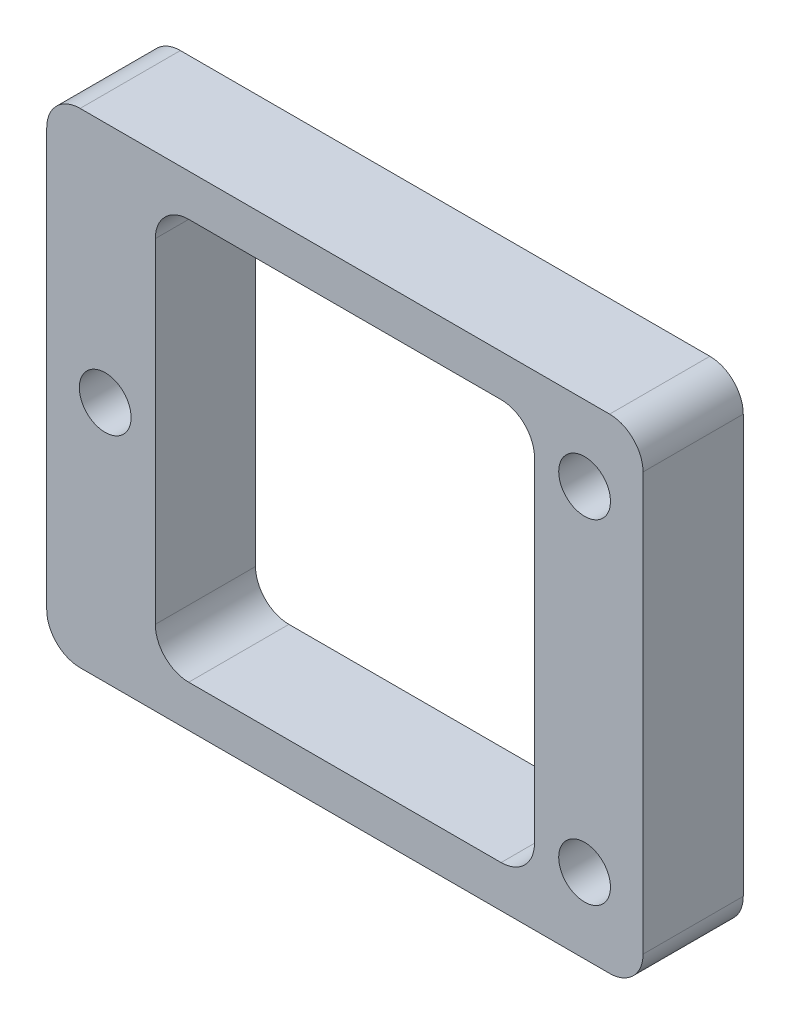
ISO-10303-21;
HEADER;
FILE_DESCRIPTION(('STEP AP214'),'2;1');
FILE_NAME('part.step','',(''),(''),'','','');
FILE_SCHEMA(('AUTOMOTIVE_DESIGN { 1 0 10303 214 1 1 1 1 }'));
ENDSEC;
DATA;
#1=APPLICATION_CONTEXT('core data for automotive mechanical design processes');
#2=APPLICATION_PROTOCOL_DEFINITION('international standard','automotive_design',2000,#1);
#3=PRODUCT_CONTEXT('',#1,'mechanical');
#4=PRODUCT('Part','Part','',(#3));
#5=PRODUCT_RELATED_PRODUCT_CATEGORY('part','',(#4));
#6=PRODUCT_DEFINITION_FORMATION('','',#4);
#7=PRODUCT_DEFINITION_CONTEXT('part definition',#1,'design');
#8=PRODUCT_DEFINITION('design','',#6,#7);
#9=PRODUCT_DEFINITION_SHAPE('','',#8);
#10=(LENGTH_UNIT() NAMED_UNIT(*) SI_UNIT(.MILLI.,.METRE.));
#11=(NAMED_UNIT(*) PLANE_ANGLE_UNIT() SI_UNIT($,.RADIAN.));
#12=(NAMED_UNIT(*) SI_UNIT($,.STERADIAN.) SOLID_ANGLE_UNIT());
#13=UNCERTAINTY_MEASURE_WITH_UNIT(LENGTH_MEASURE(1.E-05),#10,'distance_accuracy_value','');
#14=(GEOMETRIC_REPRESENTATION_CONTEXT(3) GLOBAL_UNCERTAINTY_ASSIGNED_CONTEXT((#13)) GLOBAL_UNIT_ASSIGNED_CONTEXT((#10,
#11,#12)) REPRESENTATION_CONTEXT('',''));
#15=CARTESIAN_POINT('',(0.,0.,0.));
#16=DIRECTION('',(0.,0.,1.));
#17=DIRECTION('',(1.,0.,0.));
#18=AXIS2_PLACEMENT_3D('',#15,#16,#17);
#19=CARTESIAN_POINT('',(17.85,-14.5,6.));
#20=DIRECTION('',(-1.,0.,0.));
#21=DIRECTION('',(0.,0.,1.));
#22=AXIS2_PLACEMENT_3D('',#19,#20,#21);
#23=PLANE('',#22);
#24=DIRECTION('',(0.,1.,0.));
#25=VECTOR('',#24,1.);
#26=CARTESIAN_POINT('',(17.85,-14.5,6.));
#27=LINE('',#26,#25);
#28=CARTESIAN_POINT('',(17.85,-12.5,6.));
#29=VERTEX_POINT('',#28);
#30=CARTESIAN_POINT('',(17.85,12.5,6.));
#31=VERTEX_POINT('',#30);
#32=EDGE_CURVE('E172',#29,#31,#27,.T.);
#33=ORIENTED_EDGE('',*,*,#32,.F.);
#34=DIRECTION('',(0.,0.,-1.));
#35=VECTOR('',#34,1.);
#36=CARTESIAN_POINT('',(17.85,-12.5,6.));
#37=LINE('',#36,#35);
#38=CARTESIAN_POINT('',(17.85,-12.5,0.));
#39=VERTEX_POINT('',#38);
#40=EDGE_CURVE('E157',#29,#39,#37,.T.);
#41=ORIENTED_EDGE('',*,*,#40,.T.);
#42=DIRECTION('',(0.,1.,0.));
#43=VECTOR('',#42,1.);
#44=CARTESIAN_POINT('',(17.85,-14.5,0.));
#45=LINE('',#44,#43);
#46=CARTESIAN_POINT('',(17.85,12.5,0.));
#47=VERTEX_POINT('',#46);
#48=EDGE_CURVE('E169',#39,#47,#45,.T.);
#49=ORIENTED_EDGE('',*,*,#48,.T.);
#50=DIRECTION('',(0.,0.,-1.));
#51=VECTOR('',#50,1.);
#52=CARTESIAN_POINT('',(17.85,12.5,6.));
#53=LINE('',#52,#51);
#54=EDGE_CURVE('E174',#47,#31,#53,.F.);
#55=ORIENTED_EDGE('',*,*,#54,.T.);
#56=EDGE_LOOP('',(#33,#41,#49,#55));
#57=FACE_BOUND('',#56,.T.);
#58=ADVANCED_FACE('F39',(#57),#23,.F.);
#59=CARTESIAN_POINT('',(-17.85,14.5,6.));
#60=DIRECTION('',(0.,-1.,0.));
#61=DIRECTION('',(0.,0.,-1.));
#62=AXIS2_PLACEMENT_3D('',#59,#60,#61);
#63=PLANE('',#62);
#64=DIRECTION('',(-1.,0.,0.));
#65=VECTOR('',#64,1.);
#66=CARTESIAN_POINT('',(-17.85,14.5,0.));
#67=LINE('',#66,#65);
#68=CARTESIAN_POINT('',(15.85,14.5,0.));
#69=VERTEX_POINT('',#68);
#70=CARTESIAN_POINT('',(-15.85,14.5,0.));
#71=VERTEX_POINT('',#70);
#72=EDGE_CURVE('E178',#69,#71,#67,.T.);
#73=ORIENTED_EDGE('',*,*,#72,.T.);
#74=DIRECTION('',(0.,0.,-1.));
#75=VECTOR('',#74,1.);
#76=CARTESIAN_POINT('',(-15.85,14.5,6.));
#77=LINE('',#76,#75);
#78=CARTESIAN_POINT('',(-15.85,14.5,6.));
#79=VERTEX_POINT('',#78);
#80=EDGE_CURVE('E243',#71,#79,#77,.F.);
#81=ORIENTED_EDGE('',*,*,#80,.T.);
#82=DIRECTION('',(-1.,0.,0.));
#83=VECTOR('',#82,1.);
#84=CARTESIAN_POINT('',(-17.85,14.5,6.));
#85=LINE('',#84,#83);
#86=CARTESIAN_POINT('',(15.85,14.5,6.));
#87=VERTEX_POINT('',#86);
#88=EDGE_CURVE('E314',#87,#79,#85,.T.);
#89=ORIENTED_EDGE('',*,*,#88,.F.);
#90=DIRECTION('',(0.,0.,-1.));
#91=VECTOR('',#90,1.);
#92=CARTESIAN_POINT('',(15.85,14.5,6.));
#93=LINE('',#92,#91);
#94=EDGE_CURVE('E240',#87,#69,#93,.T.);
#95=ORIENTED_EDGE('',*,*,#94,.T.);
#96=EDGE_LOOP('',(#73,#81,#89,#95));
#97=FACE_BOUND('',#96,.T.);
#98=ADVANCED_FACE('F346',(#97),#63,.F.);
#99=CARTESIAN_POINT('',(-17.85,-14.5,6.));
#100=DIRECTION('',(1.,0.,0.));
#101=DIRECTION('',(0.,0.,-1.));
#102=AXIS2_PLACEMENT_3D('',#99,#100,#101);
#103=PLANE('',#102);
#104=DIRECTION('',(0.,-1.,0.));
#105=VECTOR('',#104,1.);
#106=CARTESIAN_POINT('',(-17.85,-14.5,0.));
#107=LINE('',#106,#105);
#108=CARTESIAN_POINT('',(-17.85,12.5,0.));
#109=VERTEX_POINT('',#108);
#110=CARTESIAN_POINT('',(-17.85,-12.5,0.));
#111=VERTEX_POINT('',#110);
#112=EDGE_CURVE('E182',#109,#111,#107,.T.);
#113=ORIENTED_EDGE('',*,*,#112,.T.);
#114=DIRECTION('',(0.,0.,-1.));
#115=VECTOR('',#114,1.);
#116=CARTESIAN_POINT('',(-17.85,-12.5,6.));
#117=LINE('',#116,#115);
#118=CARTESIAN_POINT('',(-17.85,-12.5,6.));
#119=VERTEX_POINT('',#118);
#120=EDGE_CURVE('E54',#111,#119,#117,.F.);
#121=ORIENTED_EDGE('',*,*,#120,.T.);
#122=DIRECTION('',(0.,-1.,0.));
#123=VECTOR('',#122,1.);
#124=CARTESIAN_POINT('',(-17.85,-14.5,6.));
#125=LINE('',#124,#123);
#126=CARTESIAN_POINT('',(-17.85,12.5,6.));
#127=VERTEX_POINT('',#126);
#128=EDGE_CURVE('E316',#127,#119,#125,.T.);
#129=ORIENTED_EDGE('',*,*,#128,.F.);
#130=DIRECTION('',(0.,0.,-1.));
#131=VECTOR('',#130,1.);
#132=CARTESIAN_POINT('',(-17.85,12.5,6.));
#133=LINE('',#132,#131);
#134=EDGE_CURVE('E216',#127,#109,#133,.T.);
#135=ORIENTED_EDGE('',*,*,#134,.T.);
#136=EDGE_LOOP('',(#113,#121,#129,#135));
#137=FACE_BOUND('',#136,.T.);
#138=ADVANCED_FACE('F342',(#137),#103,.F.);
#139=CARTESIAN_POINT('',(-17.85,-14.5,6.));
#140=DIRECTION('',(0.,1.,0.));
#141=DIRECTION('',(0.,0.,1.));
#142=AXIS2_PLACEMENT_3D('',#139,#140,#141);
#143=PLANE('',#142);
#144=DIRECTION('',(1.,0.,0.));
#145=VECTOR('',#144,1.);
#146=CARTESIAN_POINT('',(-17.85,-14.5,0.));
#147=LINE('',#146,#145);
#148=CARTESIAN_POINT('',(-15.85,-14.5,0.));
#149=VERTEX_POINT('',#148);
#150=CARTESIAN_POINT('',(15.85,-14.5,0.));
#151=VERTEX_POINT('',#150);
#152=EDGE_CURVE('E315',#149,#151,#147,.T.);
#153=ORIENTED_EDGE('',*,*,#152,.T.);
#154=DIRECTION('',(0.,0.,-1.));
#155=VECTOR('',#154,1.);
#156=CARTESIAN_POINT('',(15.85,-14.5,6.));
#157=LINE('',#156,#155);
#158=CARTESIAN_POINT('',(15.85,-14.5,6.));
#159=VERTEX_POINT('',#158);
#160=EDGE_CURVE('E158',#151,#159,#157,.F.);
#161=ORIENTED_EDGE('',*,*,#160,.T.);
#162=DIRECTION('',(1.,0.,0.));
#163=VECTOR('',#162,1.);
#164=CARTESIAN_POINT('',(-17.85,-14.5,6.));
#165=LINE('',#164,#163);
#166=CARTESIAN_POINT('',(-15.85,-14.5,6.));
#167=VERTEX_POINT('',#166);
#168=EDGE_CURVE('E189',#167,#159,#165,.T.);
#169=ORIENTED_EDGE('',*,*,#168,.F.);
#170=DIRECTION('',(0.,0.,-1.));
#171=VECTOR('',#170,1.);
#172=CARTESIAN_POINT('',(-15.85,-14.5,6.));
#173=LINE('',#172,#171);
#174=EDGE_CURVE('E163',#167,#149,#173,.T.);
#175=ORIENTED_EDGE('',*,*,#174,.T.);
#176=EDGE_LOOP('',(#153,#161,#169,#175));
#177=FACE_BOUND('',#176,.T.);
#178=ADVANCED_FACE('F330',(#177),#143,.F.);
#179=CARTESIAN_POINT('',(0.,0.,6.));
#180=DIRECTION('',(0.,0.,-1.));
#181=DIRECTION('',(-1.,0.,0.));
#182=AXIS2_PLACEMENT_3D('',#179,#180,#181);
#183=PLANE('',#182);
#184=DIRECTION('',(0.,-1.,0.));
#185=VECTOR('',#184,1.);
#186=CARTESIAN_POINT('',(11.35,0.,6.));
#187=LINE('',#186,#185);
#188=CARTESIAN_POINT('',(11.35,9.99999999999999,6.));
#189=VERTEX_POINT('',#188);
#190=CARTESIAN_POINT('',(11.35,-10.,6.));
#191=VERTEX_POINT('',#190);
#192=EDGE_CURVE('E293',#189,#191,#187,.T.);
#193=ORIENTED_EDGE('',*,*,#192,.T.);
#194=CARTESIAN_POINT('',(9.35,-10.,6.));
#195=DIRECTION('',(0.,0.,-1.));
#196=DIRECTION('',(-1.,0.,0.));
#197=AXIS2_PLACEMENT_3D('',#194,#195,#196);
#198=CIRCLE('',#197,2.);
#199=CARTESIAN_POINT('',(9.35,-12.,6.));
#200=VERTEX_POINT('',#199);
#201=EDGE_CURVE('E247',#191,#200,#198,.T.);
#202=ORIENTED_EDGE('',*,*,#201,.T.);
#203=DIRECTION('',(-1.,0.,0.));
#204=VECTOR('',#203,1.);
#205=CARTESIAN_POINT('',(0.,-12.,6.));
#206=LINE('',#205,#204);
#207=CARTESIAN_POINT('',(-9.35,-12.,6.));
#208=VERTEX_POINT('',#207);
#209=EDGE_CURVE('E285',#200,#208,#206,.T.);
#210=ORIENTED_EDGE('',*,*,#209,.T.);
#211=CARTESIAN_POINT('',(-9.35,-10.,6.));
#212=DIRECTION('',(0.,0.,-1.));
#213=DIRECTION('',(-1.,0.,0.));
#214=AXIS2_PLACEMENT_3D('',#211,#212,#213);
#215=CIRCLE('',#214,2.);
#216=CARTESIAN_POINT('',(-11.35,-10.,6.));
#217=VERTEX_POINT('',#216);
#218=EDGE_CURVE('E12',#208,#217,#215,.T.);
#219=ORIENTED_EDGE('',*,*,#218,.T.);
#220=DIRECTION('',(0.,1.,0.));
#221=VECTOR('',#220,1.);
#222=CARTESIAN_POINT('',(-11.35,0.,6.));
#223=LINE('',#222,#221);
#224=CARTESIAN_POINT('',(-11.35,10.,6.));
#225=VERTEX_POINT('',#224);
#226=EDGE_CURVE('E283',#217,#225,#223,.T.);
#227=ORIENTED_EDGE('',*,*,#226,.T.);
#228=CARTESIAN_POINT('',(-9.35,10.,6.));
#229=DIRECTION('',(0.,0.,-1.));
#230=DIRECTION('',(-1.,0.,0.));
#231=AXIS2_PLACEMENT_3D('',#228,#229,#230);
#232=CIRCLE('',#231,2.);
#233=CARTESIAN_POINT('',(-9.35,12.,6.));
#234=VERTEX_POINT('',#233);
#235=EDGE_CURVE('E255',#225,#234,#232,.T.);
#236=ORIENTED_EDGE('',*,*,#235,.T.);
#237=DIRECTION('',(1.,0.,0.));
#238=VECTOR('',#237,1.);
#239=CARTESIAN_POINT('',(0.,12.,6.));
#240=LINE('',#239,#238);
#241=CARTESIAN_POINT('',(9.35,12.,6.));
#242=VERTEX_POINT('',#241);
#243=EDGE_CURVE('E272',#234,#242,#240,.T.);
#244=ORIENTED_EDGE('',*,*,#243,.T.);
#245=CARTESIAN_POINT('',(9.35,9.99999999999999,6.));
#246=DIRECTION('',(0.,0.,-1.));
#247=DIRECTION('',(-1.,0.,0.));
#248=AXIS2_PLACEMENT_3D('',#245,#246,#247);
#249=CIRCLE('',#248,2.);
#250=EDGE_CURVE('E251',#242,#189,#249,.T.);
#251=ORIENTED_EDGE('',*,*,#250,.T.);
#252=EDGE_LOOP('',(#193,#202,#210,#219,#227,#236,#244,#251));
#253=FACE_BOUND('',#252,.T.);
#254=CARTESIAN_POINT('',(-14.35,0.,6.));
#255=DIRECTION('',(0.,0.,-1.));
#256=DIRECTION('',(-1.,0.,0.));
#257=AXIS2_PLACEMENT_3D('',#254,#255,#256);
#258=CIRCLE('',#257,1.55);
#259=CARTESIAN_POINT('',(-15.9,0.,6.));
#260=VERTEX_POINT('',#259);
#261=EDGE_CURVE('E179',#260,#260,#258,.T.);
#262=ORIENTED_EDGE('',*,*,#261,.T.);
#263=EDGE_LOOP('',(#262));
#264=FACE_BOUND('',#263,.T.);
#265=CARTESIAN_POINT('',(14.35,10.,6.));
#266=DIRECTION('',(0.,0.,-1.));
#267=DIRECTION('',(-1.,0.,0.));
#268=AXIS2_PLACEMENT_3D('',#265,#266,#267);
#269=CIRCLE('',#268,1.55);
#270=CARTESIAN_POINT('',(12.8,10.,6.));
#271=VERTEX_POINT('',#270);
#272=EDGE_CURVE('E300',#271,#271,#269,.T.);
#273=ORIENTED_EDGE('',*,*,#272,.T.);
#274=EDGE_LOOP('',(#273));
#275=FACE_BOUND('',#274,.T.);
#276=CARTESIAN_POINT('',(14.35,-10.,6.));
#277=DIRECTION('',(0.,0.,-1.));
#278=DIRECTION('',(-1.,0.,0.));
#279=AXIS2_PLACEMENT_3D('',#276,#277,#278);
#280=CIRCLE('',#279,1.55);
#281=CARTESIAN_POINT('',(12.8,-10.,6.));
#282=VERTEX_POINT('',#281);
#283=EDGE_CURVE('E292',#282,#282,#280,.T.);
#284=ORIENTED_EDGE('',*,*,#283,.T.);
#285=EDGE_LOOP('',(#284));
#286=FACE_BOUND('',#285,.T.);
#287=ORIENTED_EDGE('',*,*,#168,.T.);
#288=CARTESIAN_POINT('',(15.85,-12.5,6.));
#289=DIRECTION('',(0.,0.,-1.));
#290=DIRECTION('',(-1.,0.,0.));
#291=AXIS2_PLACEMENT_3D('',#288,#289,#290);
#292=CIRCLE('',#291,2.);
#293=EDGE_CURVE('E214',#159,#29,#292,.F.);
#294=ORIENTED_EDGE('',*,*,#293,.T.);
#295=ORIENTED_EDGE('',*,*,#32,.T.);
#296=CARTESIAN_POINT('',(15.85,12.5,6.));
#297=DIRECTION('',(0.,0.,-1.));
#298=DIRECTION('',(-1.,0.,0.));
#299=AXIS2_PLACEMENT_3D('',#296,#297,#298);
#300=CIRCLE('',#299,2.);
#301=EDGE_CURVE('E209',#31,#87,#300,.F.);
#302=ORIENTED_EDGE('',*,*,#301,.T.);
#303=ORIENTED_EDGE('',*,*,#88,.T.);
#304=CARTESIAN_POINT('',(-15.85,12.5,6.));
#305=DIRECTION('',(0.,0.,-1.));
#306=DIRECTION('',(-1.,0.,0.));
#307=AXIS2_PLACEMENT_3D('',#304,#305,#306);
#308=CIRCLE('',#307,2.);
#309=EDGE_CURVE('E61',#79,#127,#308,.F.);
#310=ORIENTED_EDGE('',*,*,#309,.T.);
#311=ORIENTED_EDGE('',*,*,#128,.T.);
#312=CARTESIAN_POINT('',(-15.85,-12.5,6.));
#313=DIRECTION('',(0.,0.,-1.));
#314=DIRECTION('',(-1.,0.,0.));
#315=AXIS2_PLACEMENT_3D('',#312,#313,#314);
#316=CIRCLE('',#315,2.);
#317=EDGE_CURVE('E212',#119,#167,#316,.F.);
#318=ORIENTED_EDGE('',*,*,#317,.T.);
#319=EDGE_LOOP('',(#287,#294,#295,#302,#303,#310,#311,#318));
#320=FACE_BOUND('',#319,.T.);
#321=ADVANCED_FACE('F281',(#253,#264,#275,#286,#320),#183,.F.);
#322=CARTESIAN_POINT('',(0.,0.,0.));
#323=DIRECTION('',(0.,0.,-1.));
#324=DIRECTION('',(-1.,0.,0.));
#325=AXIS2_PLACEMENT_3D('',#322,#323,#324);
#326=PLANE('',#325);
#327=DIRECTION('',(0.,1.,0.));
#328=VECTOR('',#327,1.);
#329=CARTESIAN_POINT('',(-11.35,-12.,0.));
#330=LINE('',#329,#328);
#331=CARTESIAN_POINT('',(-11.35,-10.,0.));
#332=VERTEX_POINT('',#331);
#333=CARTESIAN_POINT('',(-11.35,10.,0.));
#334=VERTEX_POINT('',#333);
#335=EDGE_CURVE('E263',#332,#334,#330,.T.);
#336=ORIENTED_EDGE('',*,*,#335,.F.);
#337=CARTESIAN_POINT('',(-9.35,-10.,0.));
#338=DIRECTION('',(0.,0.,-1.));
#339=DIRECTION('',(-1.,0.,0.));
#340=AXIS2_PLACEMENT_3D('',#337,#338,#339);
#341=CIRCLE('',#340,2.);
#342=CARTESIAN_POINT('',(-9.35,-12.,0.));
#343=VERTEX_POINT('',#342);
#344=EDGE_CURVE('E47',#332,#343,#341,.F.);
#345=ORIENTED_EDGE('',*,*,#344,.T.);
#346=DIRECTION('',(-1.,0.,0.));
#347=VECTOR('',#346,1.);
#348=CARTESIAN_POINT('',(11.35,-12.,0.));
#349=LINE('',#348,#347);
#350=CARTESIAN_POINT('',(9.35,-12.,0.));
#351=VERTEX_POINT('',#350);
#352=EDGE_CURVE('E261',#351,#343,#349,.T.);
#353=ORIENTED_EDGE('',*,*,#352,.F.);
#354=CARTESIAN_POINT('',(9.35,-10.,0.));
#355=DIRECTION('',(0.,0.,-1.));
#356=DIRECTION('',(-1.,0.,0.));
#357=AXIS2_PLACEMENT_3D('',#354,#355,#356);
#358=CIRCLE('',#357,2.);
#359=CARTESIAN_POINT('',(11.35,-10.,0.));
#360=VERTEX_POINT('',#359);
#361=EDGE_CURVE('E245',#351,#360,#358,.F.);
#362=ORIENTED_EDGE('',*,*,#361,.T.);
#363=DIRECTION('',(0.,-1.,0.));
#364=VECTOR('',#363,1.);
#365=CARTESIAN_POINT('',(11.35,-12.,0.));
#366=LINE('',#365,#364);
#367=CARTESIAN_POINT('',(11.35,9.99999999999999,0.));
#368=VERTEX_POINT('',#367);
#369=EDGE_CURVE('E273',#368,#360,#366,.T.);
#370=ORIENTED_EDGE('',*,*,#369,.F.);
#371=CARTESIAN_POINT('',(9.35,9.99999999999999,0.));
#372=DIRECTION('',(0.,0.,-1.));
#373=DIRECTION('',(-1.,0.,0.));
#374=AXIS2_PLACEMENT_3D('',#371,#372,#373);
#375=CIRCLE('',#374,2.);
#376=CARTESIAN_POINT('',(9.35,12.,0.));
#377=VERTEX_POINT('',#376);
#378=EDGE_CURVE('E249',#368,#377,#375,.F.);
#379=ORIENTED_EDGE('',*,*,#378,.T.);
#380=DIRECTION('',(1.,0.,0.));
#381=VECTOR('',#380,1.);
#382=CARTESIAN_POINT('',(11.35,12.,0.));
#383=LINE('',#382,#381);
#384=CARTESIAN_POINT('',(-9.35,12.,0.));
#385=VERTEX_POINT('',#384);
#386=EDGE_CURVE('E540',#385,#377,#383,.T.);
#387=ORIENTED_EDGE('',*,*,#386,.F.);
#388=CARTESIAN_POINT('',(-9.35,10.,0.));
#389=DIRECTION('',(0.,0.,-1.));
#390=DIRECTION('',(-1.,0.,0.));
#391=AXIS2_PLACEMENT_3D('',#388,#389,#390);
#392=CIRCLE('',#391,2.);
#393=EDGE_CURVE('E253',#385,#334,#392,.F.);
#394=ORIENTED_EDGE('',*,*,#393,.T.);
#395=EDGE_LOOP('',(#336,#345,#353,#362,#370,#379,#387,#394));
#396=FACE_BOUND('',#395,.T.);
#397=CARTESIAN_POINT('',(-14.35,0.,0.));
#398=DIRECTION('',(0.,0.,-1.));
#399=DIRECTION('',(-1.,0.,0.));
#400=AXIS2_PLACEMENT_3D('',#397,#398,#399);
#401=CIRCLE('',#400,1.55);
#402=CARTESIAN_POINT('',(-15.9,0.,0.));
#403=VERTEX_POINT('',#402);
#404=EDGE_CURVE('E185',#403,#403,#401,.T.);
#405=ORIENTED_EDGE('',*,*,#404,.F.);
#406=EDGE_LOOP('',(#405));
#407=FACE_BOUND('',#406,.T.);
#408=CARTESIAN_POINT('',(14.35,10.,0.));
#409=DIRECTION('',(0.,0.,-1.));
#410=DIRECTION('',(-1.,0.,0.));
#411=AXIS2_PLACEMENT_3D('',#408,#409,#410);
#412=CIRCLE('',#411,1.55);
#413=CARTESIAN_POINT('',(12.8,10.,0.));
#414=VERTEX_POINT('',#413);
#415=EDGE_CURVE('E306',#414,#414,#412,.T.);
#416=ORIENTED_EDGE('',*,*,#415,.F.);
#417=EDGE_LOOP('',(#416));
#418=FACE_BOUND('',#417,.T.);
#419=CARTESIAN_POINT('',(14.35,-10.,0.));
#420=DIRECTION('',(0.,0.,-1.));
#421=DIRECTION('',(-1.,0.,0.));
#422=AXIS2_PLACEMENT_3D('',#419,#420,#421);
#423=CIRCLE('',#422,1.55);
#424=CARTESIAN_POINT('',(12.8,-10.,0.));
#425=VERTEX_POINT('',#424);
#426=EDGE_CURVE('E289',#425,#425,#423,.T.);
#427=ORIENTED_EDGE('',*,*,#426,.F.);
#428=EDGE_LOOP('',(#427));
#429=FACE_BOUND('',#428,.T.);
#430=ORIENTED_EDGE('',*,*,#48,.F.);
#431=CARTESIAN_POINT('',(15.85,-12.5,0.));
#432=DIRECTION('',(0.,0.,-1.));
#433=DIRECTION('',(-1.,0.,0.));
#434=AXIS2_PLACEMENT_3D('',#431,#432,#433);
#435=CIRCLE('',#434,2.);
#436=EDGE_CURVE('E153',#39,#151,#435,.T.);
#437=ORIENTED_EDGE('',*,*,#436,.T.);
#438=ORIENTED_EDGE('',*,*,#152,.F.);
#439=CARTESIAN_POINT('',(-15.85,-12.5,0.));
#440=DIRECTION('',(0.,0.,-1.));
#441=DIRECTION('',(-1.,0.,0.));
#442=AXIS2_PLACEMENT_3D('',#439,#440,#441);
#443=CIRCLE('',#442,2.);
#444=EDGE_CURVE('E164',#149,#111,#443,.T.);
#445=ORIENTED_EDGE('',*,*,#444,.T.);
#446=ORIENTED_EDGE('',*,*,#112,.F.);
#447=CARTESIAN_POINT('',(-15.85,12.5,0.));
#448=DIRECTION('',(0.,0.,-1.));
#449=DIRECTION('',(-1.,0.,0.));
#450=AXIS2_PLACEMENT_3D('',#447,#448,#449);
#451=CIRCLE('',#450,2.);
#452=EDGE_CURVE('E323',#109,#71,#451,.T.);
#453=ORIENTED_EDGE('',*,*,#452,.T.);
#454=ORIENTED_EDGE('',*,*,#72,.F.);
#455=CARTESIAN_POINT('',(15.85,12.5,0.));
#456=DIRECTION('',(0.,0.,-1.));
#457=DIRECTION('',(-1.,0.,0.));
#458=AXIS2_PLACEMENT_3D('',#455,#456,#457);
#459=CIRCLE('',#458,2.);
#460=EDGE_CURVE('E173',#69,#47,#459,.T.);
#461=ORIENTED_EDGE('',*,*,#460,.T.);
#462=EDGE_LOOP('',(#430,#437,#438,#445,#446,#453,#454,#461));
#463=FACE_BOUND('',#462,.T.);
#464=ADVANCED_FACE('F176',(#396,#407,#418,#429,#463),#326,.T.);
#465=CARTESIAN_POINT('',(14.35,-10.,6.));
#466=DIRECTION('',(0.,0.,-1.));
#467=DIRECTION('',(-1.,0.,0.));
#468=AXIS2_PLACEMENT_3D('',#465,#466,#467);
#469=CYLINDRICAL_SURFACE('',#468,1.55);
#470=ORIENTED_EDGE('',*,*,#283,.F.);
#471=EDGE_LOOP('',(#470));
#472=FACE_BOUND('',#471,.T.);
#473=ORIENTED_EDGE('',*,*,#426,.T.);
#474=EDGE_LOOP('',(#473));
#475=FACE_BOUND('',#474,.T.);
#476=ADVANCED_FACE('F340',(#472,#475),#469,.F.);
#477=CARTESIAN_POINT('',(14.35,10.,6.));
#478=DIRECTION('',(0.,0.,-1.));
#479=DIRECTION('',(-1.,0.,0.));
#480=AXIS2_PLACEMENT_3D('',#477,#478,#479);
#481=CYLINDRICAL_SURFACE('',#480,1.55);
#482=ORIENTED_EDGE('',*,*,#272,.F.);
#483=EDGE_LOOP('',(#482));
#484=FACE_BOUND('',#483,.T.);
#485=ORIENTED_EDGE('',*,*,#415,.T.);
#486=EDGE_LOOP('',(#485));
#487=FACE_BOUND('',#486,.T.);
#488=ADVANCED_FACE('F494',(#484,#487),#481,.F.);
#489=CARTESIAN_POINT('',(-14.35,0.,6.));
#490=DIRECTION('',(0.,0.,-1.));
#491=DIRECTION('',(-1.,0.,0.));
#492=AXIS2_PLACEMENT_3D('',#489,#490,#491);
#493=CYLINDRICAL_SURFACE('',#492,1.55);
#494=ORIENTED_EDGE('',*,*,#261,.F.);
#495=EDGE_LOOP('',(#494));
#496=FACE_BOUND('',#495,.T.);
#497=ORIENTED_EDGE('',*,*,#404,.T.);
#498=EDGE_LOOP('',(#497));
#499=FACE_BOUND('',#498,.T.);
#500=ADVANCED_FACE('F412',(#496,#499),#493,.F.);
#501=CARTESIAN_POINT('',(-11.35,-12.,10.));
#502=DIRECTION('',(-1.,0.,0.));
#503=DIRECTION('',(0.,0.,1.));
#504=AXIS2_PLACEMENT_3D('',#501,#502,#503);
#505=PLANE('',#504);
#506=ORIENTED_EDGE('',*,*,#335,.T.);
#507=DIRECTION('',(0.,0.,-1.));
#508=VECTOR('',#507,1.);
#509=CARTESIAN_POINT('',(-11.35,10.,6.));
#510=LINE('',#509,#508);
#511=EDGE_CURVE('E238',#334,#225,#510,.F.);
#512=ORIENTED_EDGE('',*,*,#511,.T.);
#513=ORIENTED_EDGE('',*,*,#226,.F.);
#514=DIRECTION('',(0.,0.,-1.));
#515=VECTOR('',#514,1.);
#516=CARTESIAN_POINT('',(-11.35,-10.,0.));
#517=LINE('',#516,#515);
#518=EDGE_CURVE('E235',#217,#332,#517,.T.);
#519=ORIENTED_EDGE('',*,*,#518,.T.);
#520=EDGE_LOOP('',(#506,#512,#513,#519));
#521=FACE_BOUND('',#520,.T.);
#522=ADVANCED_FACE('F287',(#521),#505,.F.);
#523=CARTESIAN_POINT('',(11.35,-12.,10.));
#524=DIRECTION('',(0.,-1.,0.));
#525=DIRECTION('',(1.,0.,0.));
#526=AXIS2_PLACEMENT_3D('',#523,#524,#525);
#527=PLANE('',#526);
#528=ORIENTED_EDGE('',*,*,#209,.F.);
#529=DIRECTION('',(0.,0.,-1.));
#530=VECTOR('',#529,1.);
#531=CARTESIAN_POINT('',(9.35,-12.,0.));
#532=LINE('',#531,#530);
#533=EDGE_CURVE('E222',#200,#351,#532,.T.);
#534=ORIENTED_EDGE('',*,*,#533,.T.);
#535=ORIENTED_EDGE('',*,*,#352,.T.);
#536=DIRECTION('',(0.,0.,-1.));
#537=VECTOR('',#536,1.);
#538=CARTESIAN_POINT('',(-9.35,-12.,6.));
#539=LINE('',#538,#537);
#540=EDGE_CURVE('E220',#343,#208,#539,.F.);
#541=ORIENTED_EDGE('',*,*,#540,.T.);
#542=EDGE_LOOP('',(#528,#534,#535,#541));
#543=FACE_BOUND('',#542,.T.);
#544=ADVANCED_FACE('F269',(#543),#527,.F.);
#545=CARTESIAN_POINT('',(11.35,-12.,10.));
#546=DIRECTION('',(1.,0.,0.));
#547=DIRECTION('',(0.,1.,0.));
#548=AXIS2_PLACEMENT_3D('',#545,#546,#547);
#549=PLANE('',#548);
#550=ORIENTED_EDGE('',*,*,#369,.T.);
#551=DIRECTION('',(0.,0.,-1.));
#552=VECTOR('',#551,1.);
#553=CARTESIAN_POINT('',(11.35,-10.,6.));
#554=LINE('',#553,#552);
#555=EDGE_CURVE('E228',#360,#191,#554,.F.);
#556=ORIENTED_EDGE('',*,*,#555,.T.);
#557=ORIENTED_EDGE('',*,*,#192,.F.);
#558=DIRECTION('',(0.,0.,-1.));
#559=VECTOR('',#558,1.);
#560=CARTESIAN_POINT('',(11.35,9.99999999999999,0.));
#561=LINE('',#560,#559);
#562=EDGE_CURVE('E225',#189,#368,#561,.T.);
#563=ORIENTED_EDGE('',*,*,#562,.T.);
#564=EDGE_LOOP('',(#550,#556,#557,#563));
#565=FACE_BOUND('',#564,.T.);
#566=ADVANCED_FACE('F423',(#565),#549,.F.);
#567=CARTESIAN_POINT('',(11.35,12.,10.));
#568=DIRECTION('',(0.,1.,0.));
#569=DIRECTION('',(-1.,0.,0.));
#570=AXIS2_PLACEMENT_3D('',#567,#568,#569);
#571=PLANE('',#570);
#572=ORIENTED_EDGE('',*,*,#386,.T.);
#573=DIRECTION('',(0.,0.,-1.));
#574=VECTOR('',#573,1.);
#575=CARTESIAN_POINT('',(9.35,12.,6.));
#576=LINE('',#575,#574);
#577=EDGE_CURVE('E233',#377,#242,#576,.F.);
#578=ORIENTED_EDGE('',*,*,#577,.T.);
#579=ORIENTED_EDGE('',*,*,#243,.F.);
#580=DIRECTION('',(0.,0.,-1.));
#581=VECTOR('',#580,1.);
#582=CARTESIAN_POINT('',(-9.35,12.,0.));
#583=LINE('',#582,#581);
#584=EDGE_CURVE('E230',#234,#385,#583,.T.);
#585=ORIENTED_EDGE('',*,*,#584,.T.);
#586=EDGE_LOOP('',(#572,#578,#579,#585));
#587=FACE_BOUND('',#586,.T.);
#588=ADVANCED_FACE('F357',(#587),#571,.F.);
#589=CARTESIAN_POINT('',(15.85,-12.5,6.));
#590=DIRECTION('',(0.,0.,-1.));
#591=DIRECTION('',(-1.,0.,0.));
#592=AXIS2_PLACEMENT_3D('',#589,#590,#591);
#593=CYLINDRICAL_SURFACE('',#592,2.);
#594=ORIENTED_EDGE('',*,*,#293,.F.);
#595=ORIENTED_EDGE('',*,*,#160,.F.);
#596=ORIENTED_EDGE('',*,*,#436,.F.);
#597=ORIENTED_EDGE('',*,*,#40,.F.);
#598=EDGE_LOOP('',(#594,#595,#596,#597));
#599=FACE_BOUND('',#598,.T.);
#600=ADVANCED_FACE('F156',(#599),#593,.T.);
#601=CARTESIAN_POINT('',(-15.85,-12.5,6.));
#602=DIRECTION('',(0.,0.,-1.));
#603=DIRECTION('',(-1.,0.,0.));
#604=AXIS2_PLACEMENT_3D('',#601,#602,#603);
#605=CYLINDRICAL_SURFACE('',#604,2.);
#606=ORIENTED_EDGE('',*,*,#317,.F.);
#607=ORIENTED_EDGE('',*,*,#120,.F.);
#608=ORIENTED_EDGE('',*,*,#444,.F.);
#609=ORIENTED_EDGE('',*,*,#174,.F.);
#610=EDGE_LOOP('',(#606,#607,#608,#609));
#611=FACE_BOUND('',#610,.T.);
#612=ADVANCED_FACE('F333',(#611),#605,.T.);
#613=CARTESIAN_POINT('',(9.35,-10.,10.));
#614=DIRECTION('',(0.,0.,1.));
#615=DIRECTION('',(1.,0.,0.));
#616=AXIS2_PLACEMENT_3D('',#613,#614,#615);
#617=CYLINDRICAL_SURFACE('',#616,2.);
#618=ORIENTED_EDGE('',*,*,#201,.F.);
#619=ORIENTED_EDGE('',*,*,#555,.F.);
#620=ORIENTED_EDGE('',*,*,#361,.F.);
#621=ORIENTED_EDGE('',*,*,#533,.F.);
#622=EDGE_LOOP('',(#618,#619,#620,#621));
#623=FACE_BOUND('',#622,.T.);
#624=ADVANCED_FACE('F360',(#623),#617,.F.);
#625=CARTESIAN_POINT('',(9.35,9.99999999999999,10.));
#626=DIRECTION('',(0.,0.,1.));
#627=DIRECTION('',(1.,0.,0.));
#628=AXIS2_PLACEMENT_3D('',#625,#626,#627);
#629=CYLINDRICAL_SURFACE('',#628,2.);
#630=ORIENTED_EDGE('',*,*,#250,.F.);
#631=ORIENTED_EDGE('',*,*,#577,.F.);
#632=ORIENTED_EDGE('',*,*,#378,.F.);
#633=ORIENTED_EDGE('',*,*,#562,.F.);
#634=EDGE_LOOP('',(#630,#631,#632,#633));
#635=FACE_BOUND('',#634,.T.);
#636=ADVANCED_FACE('F363',(#635),#629,.F.);
#637=CARTESIAN_POINT('',(-9.35,10.,10.));
#638=DIRECTION('',(0.,0.,1.));
#639=DIRECTION('',(1.,0.,0.));
#640=AXIS2_PLACEMENT_3D('',#637,#638,#639);
#641=CYLINDRICAL_SURFACE('',#640,2.);
#642=ORIENTED_EDGE('',*,*,#235,.F.);
#643=ORIENTED_EDGE('',*,*,#511,.F.);
#644=ORIENTED_EDGE('',*,*,#393,.F.);
#645=ORIENTED_EDGE('',*,*,#584,.F.);
#646=EDGE_LOOP('',(#642,#643,#644,#645));
#647=FACE_BOUND('',#646,.T.);
#648=ADVANCED_FACE('F367',(#647),#641,.F.);
#649=CARTESIAN_POINT('',(-9.35,-10.,10.));
#650=DIRECTION('',(0.,0.,1.));
#651=DIRECTION('',(1.,0.,0.));
#652=AXIS2_PLACEMENT_3D('',#649,#650,#651);
#653=CYLINDRICAL_SURFACE('',#652,2.);
#654=ORIENTED_EDGE('',*,*,#218,.F.);
#655=ORIENTED_EDGE('',*,*,#540,.F.);
#656=ORIENTED_EDGE('',*,*,#344,.F.);
#657=ORIENTED_EDGE('',*,*,#518,.F.);
#658=EDGE_LOOP('',(#654,#655,#656,#657));
#659=FACE_BOUND('',#658,.T.);
#660=ADVANCED_FACE('F276',(#659),#653,.F.);
#661=CARTESIAN_POINT('',(-15.85,12.5,6.));
#662=DIRECTION('',(0.,0.,-1.));
#663=DIRECTION('',(-1.,0.,0.));
#664=AXIS2_PLACEMENT_3D('',#661,#662,#663);
#665=CYLINDRICAL_SURFACE('',#664,2.);
#666=ORIENTED_EDGE('',*,*,#309,.F.);
#667=ORIENTED_EDGE('',*,*,#80,.F.);
#668=ORIENTED_EDGE('',*,*,#452,.F.);
#669=ORIENTED_EDGE('',*,*,#134,.F.);
#670=EDGE_LOOP('',(#666,#667,#668,#669));
#671=FACE_BOUND('',#670,.T.);
#672=ADVANCED_FACE('F373',(#671),#665,.T.);
#673=CARTESIAN_POINT('',(15.85,12.5,6.));
#674=DIRECTION('',(0.,0.,-1.));
#675=DIRECTION('',(-1.,0.,0.));
#676=AXIS2_PLACEMENT_3D('',#673,#674,#675);
#677=CYLINDRICAL_SURFACE('',#676,2.);
#678=ORIENTED_EDGE('',*,*,#301,.F.);
#679=ORIENTED_EDGE('',*,*,#54,.F.);
#680=ORIENTED_EDGE('',*,*,#460,.F.);
#681=ORIENTED_EDGE('',*,*,#94,.F.);
#682=EDGE_LOOP('',(#678,#679,#680,#681));
#683=FACE_BOUND('',#682,.T.);
#684=ADVANCED_FACE('F41',(#683),#677,.T.);
#685=CLOSED_SHELL('',(#58,#98,#138,#178,#321,#464,#476,#488,#500,#522,#544,#566,#588,#600,#612,
#624,#636,#648,#660,#672,#684));
#686=MANIFOLD_SOLID_BREP('B2',#685);
#687=ADVANCED_BREP_SHAPE_REPRESENTATION('',(#18,#686),#14);
#688=SHAPE_DEFINITION_REPRESENTATION(#9,#687);
ENDSEC;
END-ISO-10303-21;
